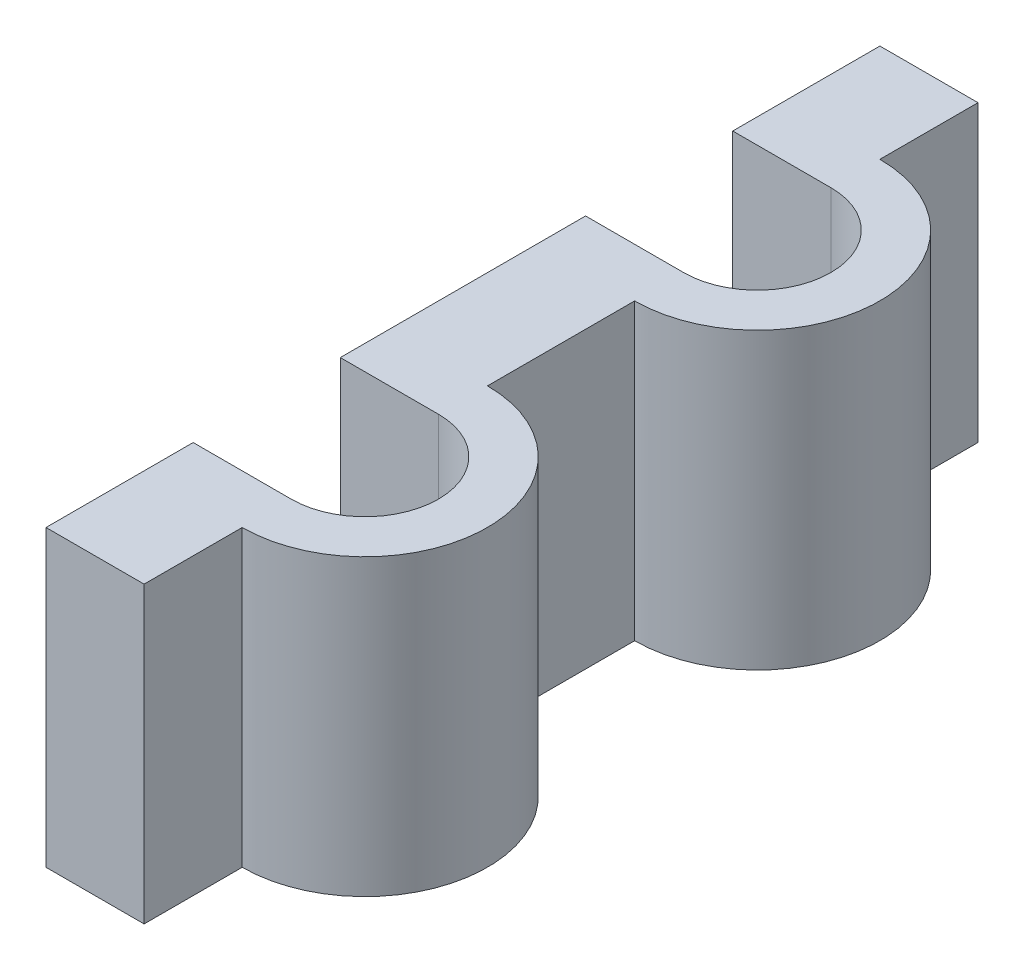
ISO-10303-21;
HEADER;
FILE_DESCRIPTION(('STEP AP214'),'2;1');
FILE_NAME('part.step','',(''),(''),'','','');
FILE_SCHEMA(('AUTOMOTIVE_DESIGN { 1 0 10303 214 1 1 1 1 }'));
ENDSEC;
DATA;
#1=APPLICATION_CONTEXT('core data for automotive mechanical design processes');
#2=APPLICATION_PROTOCOL_DEFINITION('international standard','automotive_design',2000,#1);
#3=PRODUCT_CONTEXT('',#1,'mechanical');
#4=PRODUCT('Part','Part','',(#3));
#5=PRODUCT_RELATED_PRODUCT_CATEGORY('part','',(#4));
#6=PRODUCT_DEFINITION_FORMATION('','',#4);
#7=PRODUCT_DEFINITION_CONTEXT('part definition',#1,'design');
#8=PRODUCT_DEFINITION('design','',#6,#7);
#9=PRODUCT_DEFINITION_SHAPE('','',#8);
#10=(LENGTH_UNIT() NAMED_UNIT(*) SI_UNIT(.MILLI.,.METRE.));
#11=(NAMED_UNIT(*) PLANE_ANGLE_UNIT() SI_UNIT($,.RADIAN.));
#12=(NAMED_UNIT(*) SI_UNIT($,.STERADIAN.) SOLID_ANGLE_UNIT());
#13=UNCERTAINTY_MEASURE_WITH_UNIT(LENGTH_MEASURE(1.E-05),#10,'distance_accuracy_value','');
#14=(GEOMETRIC_REPRESENTATION_CONTEXT(3) GLOBAL_UNCERTAINTY_ASSIGNED_CONTEXT((#13)) GLOBAL_UNIT_ASSIGNED_CONTEXT((#10,
#11,#12)) REPRESENTATION_CONTEXT('',''));
#15=CARTESIAN_POINT('',(0.,0.,0.));
#16=DIRECTION('',(0.,0.,1.));
#17=DIRECTION('',(1.,0.,0.));
#18=AXIS2_PLACEMENT_3D('',#15,#16,#17);
#19=CARTESIAN_POINT('',(0.,30.,0.));
#20=DIRECTION('',(0.,0.,-1.));
#21=DIRECTION('',(-1.,0.,0.));
#22=AXIS2_PLACEMENT_3D('',#19,#20,#21);
#23=PLANE('',#22);
#24=DIRECTION('',(1.,0.,0.));
#25=VECTOR('',#24,1.);
#26=CARTESIAN_POINT('',(0.,0.,0.));
#27=LINE('',#26,#25);
#28=CARTESIAN_POINT('',(0.,0.,0.));
#29=VERTEX_POINT('',#28);
#30=CARTESIAN_POINT('',(10.,0.,0.));
#31=VERTEX_POINT('',#30);
#32=EDGE_CURVE('E179',#29,#31,#27,.T.);
#33=ORIENTED_EDGE('',*,*,#32,.T.);
#34=DIRECTION('',(0.,-1.,0.));
#35=VECTOR('',#34,1.);
#36=CARTESIAN_POINT('',(10.,30.,0.));
#37=LINE('',#36,#35);
#38=CARTESIAN_POINT('',(10.,30.,0.));
#39=VERTEX_POINT('',#38);
#40=EDGE_CURVE('E11',#39,#31,#37,.T.);
#41=ORIENTED_EDGE('',*,*,#40,.F.);
#42=DIRECTION('',(1.,0.,0.));
#43=VECTOR('',#42,1.);
#44=CARTESIAN_POINT('',(0.,30.,0.));
#45=LINE('',#44,#43);
#46=CARTESIAN_POINT('',(0.,30.,0.));
#47=VERTEX_POINT('',#46);
#48=EDGE_CURVE('E209',#47,#39,#45,.T.);
#49=ORIENTED_EDGE('',*,*,#48,.F.);
#50=DIRECTION('',(0.,-1.,0.));
#51=VECTOR('',#50,1.);
#52=CARTESIAN_POINT('',(0.,30.,0.));
#53=LINE('',#52,#51);
#54=EDGE_CURVE('E175',#47,#29,#53,.T.);
#55=ORIENTED_EDGE('',*,*,#54,.T.);
#56=EDGE_LOOP('',(#33,#41,#49,#55));
#57=FACE_BOUND('',#56,.T.);
#58=ADVANCED_FACE('F35',(#57),#23,.F.);
#59=CARTESIAN_POINT('',(10.,30.,0.));
#60=DIRECTION('',(-1.,0.,0.));
#61=DIRECTION('',(0.,0.,1.));
#62=AXIS2_PLACEMENT_3D('',#59,#60,#61);
#63=PLANE('',#62);
#64=DIRECTION('',(0.,0.,-1.));
#65=VECTOR('',#64,1.);
#66=CARTESIAN_POINT('',(10.,0.,0.));
#67=LINE('',#66,#65);
#68=CARTESIAN_POINT('',(10.,0.,-10.));
#69=VERTEX_POINT('',#68);
#70=EDGE_CURVE('E182',#31,#69,#67,.T.);
#71=ORIENTED_EDGE('',*,*,#70,.T.);
#72=DIRECTION('',(0.,-1.,0.));
#73=VECTOR('',#72,1.);
#74=CARTESIAN_POINT('',(10.,30.,-10.));
#75=LINE('',#74,#73);
#76=CARTESIAN_POINT('',(10.,30.,-10.));
#77=VERTEX_POINT('',#76);
#78=EDGE_CURVE('E43',#77,#69,#75,.T.);
#79=ORIENTED_EDGE('',*,*,#78,.F.);
#80=DIRECTION('',(0.,0.,-1.));
#81=VECTOR('',#80,1.);
#82=CARTESIAN_POINT('',(10.,30.,0.));
#83=LINE('',#82,#81);
#84=EDGE_CURVE('E118',#39,#77,#83,.T.);
#85=ORIENTED_EDGE('',*,*,#84,.F.);
#86=ORIENTED_EDGE('',*,*,#40,.T.);
#87=EDGE_LOOP('',(#71,#79,#85,#86));
#88=FACE_BOUND('',#87,.T.);
#89=ADVANCED_FACE('F307',(#88),#63,.F.);
#90=CARTESIAN_POINT('',(10.,30.,-22.5));
#91=DIRECTION('',(0.,-1.,0.));
#92=DIRECTION('',(0.,0.,-1.));
#93=AXIS2_PLACEMENT_3D('',#90,#91,#92);
#94=CYLINDRICAL_SURFACE('',#93,12.5);
#95=CARTESIAN_POINT('',(10.,0.,-22.5));
#96=DIRECTION('',(0.,1.,0.));
#97=DIRECTION('',(0.,0.,1.));
#98=AXIS2_PLACEMENT_3D('',#95,#96,#97);
#99=CIRCLE('',#98,12.5);
#100=CARTESIAN_POINT('',(10.,0.,-34.9999999999999));
#101=VERTEX_POINT('',#100);
#102=EDGE_CURVE('E184',#69,#101,#99,.T.);
#103=ORIENTED_EDGE('',*,*,#102,.T.);
#104=DIRECTION('',(0.,-1.,0.));
#105=VECTOR('',#104,1.);
#106=CARTESIAN_POINT('',(10.,30.,-34.9999999999999));
#107=LINE('',#106,#105);
#108=CARTESIAN_POINT('',(10.,30.,-34.9999999999999));
#109=VERTEX_POINT('',#108);
#110=EDGE_CURVE('E240',#109,#101,#107,.T.);
#111=ORIENTED_EDGE('',*,*,#110,.F.);
#112=CARTESIAN_POINT('',(10.,30.,-22.5));
#113=DIRECTION('',(0.,1.,0.));
#114=DIRECTION('',(0.,0.,1.));
#115=AXIS2_PLACEMENT_3D('',#112,#113,#114);
#116=CIRCLE('',#115,12.5);
#117=EDGE_CURVE('E248',#77,#109,#116,.T.);
#118=ORIENTED_EDGE('',*,*,#117,.F.);
#119=ORIENTED_EDGE('',*,*,#78,.T.);
#120=EDGE_LOOP('',(#103,#111,#118,#119));
#121=FACE_BOUND('',#120,.T.);
#122=ADVANCED_FACE('F246',(#121),#94,.T.);
#123=CARTESIAN_POINT('',(10.,30.,-34.9999999999999));
#124=DIRECTION('',(-1.,0.,0.));
#125=DIRECTION('',(0.,0.,1.));
#126=AXIS2_PLACEMENT_3D('',#123,#124,#125);
#127=PLANE('',#126);
#128=DIRECTION('',(0.,0.,-1.));
#129=VECTOR('',#128,1.);
#130=CARTESIAN_POINT('',(10.,0.,-34.9999999999999));
#131=LINE('',#130,#129);
#132=CARTESIAN_POINT('',(9.99999999999999,0.,-50.));
#133=VERTEX_POINT('',#132);
#134=EDGE_CURVE('E186',#101,#133,#131,.T.);
#135=ORIENTED_EDGE('',*,*,#134,.T.);
#136=DIRECTION('',(0.,-1.,0.));
#137=VECTOR('',#136,1.);
#138=CARTESIAN_POINT('',(9.99999999999999,30.,-50.));
#139=LINE('',#138,#137);
#140=CARTESIAN_POINT('',(9.99999999999999,30.,-50.));
#141=VERTEX_POINT('',#140);
#142=EDGE_CURVE('E237',#141,#133,#139,.T.);
#143=ORIENTED_EDGE('',*,*,#142,.F.);
#144=DIRECTION('',(0.,0.,-1.));
#145=VECTOR('',#144,1.);
#146=CARTESIAN_POINT('',(10.,30.,-34.9999999999999));
#147=LINE('',#146,#145);
#148=EDGE_CURVE('E266',#109,#141,#147,.T.);
#149=ORIENTED_EDGE('',*,*,#148,.F.);
#150=ORIENTED_EDGE('',*,*,#110,.T.);
#151=EDGE_LOOP('',(#135,#143,#149,#150));
#152=FACE_BOUND('',#151,.T.);
#153=ADVANCED_FACE('F257',(#152),#127,.F.);
#154=CARTESIAN_POINT('',(10.,30.,-62.5));
#155=DIRECTION('',(0.,-1.,0.));
#156=DIRECTION('',(0.,0.,-1.));
#157=AXIS2_PLACEMENT_3D('',#154,#155,#156);
#158=CYLINDRICAL_SURFACE('',#157,12.5);
#159=CARTESIAN_POINT('',(10.,0.,-62.5));
#160=DIRECTION('',(0.,1.,0.));
#161=DIRECTION('',(0.,0.,-1.));
#162=AXIS2_PLACEMENT_3D('',#159,#160,#161);
#163=CIRCLE('',#162,12.5);
#164=CARTESIAN_POINT('',(10.,0.,-74.9999999999999));
#165=VERTEX_POINT('',#164);
#166=EDGE_CURVE('E188',#133,#165,#163,.T.);
#167=ORIENTED_EDGE('',*,*,#166,.T.);
#168=DIRECTION('',(0.,-1.,0.));
#169=VECTOR('',#168,1.);
#170=CARTESIAN_POINT('',(10.,30.,-74.9999999999999));
#171=LINE('',#170,#169);
#172=CARTESIAN_POINT('',(10.,30.,-74.9999999999999));
#173=VERTEX_POINT('',#172);
#174=EDGE_CURVE('E234',#173,#165,#171,.T.);
#175=ORIENTED_EDGE('',*,*,#174,.F.);
#176=CARTESIAN_POINT('',(10.,30.,-62.5));
#177=DIRECTION('',(0.,1.,0.));
#178=DIRECTION('',(0.,0.,-1.));
#179=AXIS2_PLACEMENT_3D('',#176,#177,#178);
#180=CIRCLE('',#179,12.5);
#181=EDGE_CURVE('E263',#141,#173,#180,.T.);
#182=ORIENTED_EDGE('',*,*,#181,.F.);
#183=ORIENTED_EDGE('',*,*,#142,.T.);
#184=EDGE_LOOP('',(#167,#175,#182,#183));
#185=FACE_BOUND('',#184,.T.);
#186=ADVANCED_FACE('F261',(#185),#158,.T.);
#187=CARTESIAN_POINT('',(10.,30.,-84.9999999999999));
#188=DIRECTION('',(-1.,0.,0.));
#189=DIRECTION('',(0.,0.,1.));
#190=AXIS2_PLACEMENT_3D('',#187,#188,#189);
#191=PLANE('',#190);
#192=DIRECTION('',(0.,0.,-1.));
#193=VECTOR('',#192,1.);
#194=CARTESIAN_POINT('',(10.,0.,-84.9999999999999));
#195=LINE('',#194,#193);
#196=CARTESIAN_POINT('',(10.,0.,-84.9999999999999));
#197=VERTEX_POINT('',#196);
#198=EDGE_CURVE('E190',#165,#197,#195,.T.);
#199=ORIENTED_EDGE('',*,*,#198,.T.);
#200=DIRECTION('',(0.,-1.,0.));
#201=VECTOR('',#200,1.);
#202=CARTESIAN_POINT('',(10.,30.,-84.9999999999999));
#203=LINE('',#202,#201);
#204=CARTESIAN_POINT('',(10.,30.,-84.9999999999999));
#205=VERTEX_POINT('',#204);
#206=EDGE_CURVE('E231',#205,#197,#203,.T.);
#207=ORIENTED_EDGE('',*,*,#206,.F.);
#208=DIRECTION('',(0.,0.,-1.));
#209=VECTOR('',#208,1.);
#210=CARTESIAN_POINT('',(10.,30.,-84.9999999999999));
#211=LINE('',#210,#209);
#212=EDGE_CURVE('E265',#173,#205,#211,.T.);
#213=ORIENTED_EDGE('',*,*,#212,.F.);
#214=ORIENTED_EDGE('',*,*,#174,.T.);
#215=EDGE_LOOP('',(#199,#207,#213,#214));
#216=FACE_BOUND('',#215,.T.);
#217=ADVANCED_FACE('F320',(#216),#191,.F.);
#218=CARTESIAN_POINT('',(0.,30.,-84.9999999999999));
#219=DIRECTION('',(0.,0.,1.));
#220=DIRECTION('',(1.,0.,0.));
#221=AXIS2_PLACEMENT_3D('',#218,#219,#220);
#222=PLANE('',#221);
#223=DIRECTION('',(-1.,0.,0.));
#224=VECTOR('',#223,1.);
#225=CARTESIAN_POINT('',(0.,0.,-84.9999999999999));
#226=LINE('',#225,#224);
#227=CARTESIAN_POINT('',(0.,0.,-84.9999999999999));
#228=VERTEX_POINT('',#227);
#229=EDGE_CURVE('E192',#197,#228,#226,.T.);
#230=ORIENTED_EDGE('',*,*,#229,.T.);
#231=DIRECTION('',(0.,-1.,0.));
#232=VECTOR('',#231,1.);
#233=CARTESIAN_POINT('',(0.,30.,-84.9999999999999));
#234=LINE('',#233,#232);
#235=CARTESIAN_POINT('',(0.,30.,-84.9999999999999));
#236=VERTEX_POINT('',#235);
#237=EDGE_CURVE('E228',#236,#228,#234,.T.);
#238=ORIENTED_EDGE('',*,*,#237,.F.);
#239=DIRECTION('',(-1.,0.,0.));
#240=VECTOR('',#239,1.);
#241=CARTESIAN_POINT('',(0.,30.,-84.9999999999999));
#242=LINE('',#241,#240);
#243=EDGE_CURVE('E268',#205,#236,#242,.T.);
#244=ORIENTED_EDGE('',*,*,#243,.F.);
#245=ORIENTED_EDGE('',*,*,#206,.T.);
#246=EDGE_LOOP('',(#230,#238,#244,#245));
#247=FACE_BOUND('',#246,.T.);
#248=ADVANCED_FACE('F323',(#247),#222,.F.);
#249=CARTESIAN_POINT('',(0.,30.,-84.9999999999999));
#250=DIRECTION('',(1.,0.,0.));
#251=DIRECTION('',(0.,0.,-1.));
#252=AXIS2_PLACEMENT_3D('',#249,#250,#251);
#253=PLANE('',#252);
#254=DIRECTION('',(0.,0.,1.));
#255=VECTOR('',#254,1.);
#256=CARTESIAN_POINT('',(0.,0.,-84.9999999999999));
#257=LINE('',#256,#255);
#258=CARTESIAN_POINT('',(0.,0.,-70.));
#259=VERTEX_POINT('',#258);
#260=EDGE_CURVE('E194',#228,#259,#257,.T.);
#261=ORIENTED_EDGE('',*,*,#260,.T.);
#262=DIRECTION('',(0.,-1.,0.));
#263=VECTOR('',#262,1.);
#264=CARTESIAN_POINT('',(0.,30.,-70.));
#265=LINE('',#264,#263);
#266=CARTESIAN_POINT('',(0.,30.,-70.));
#267=VERTEX_POINT('',#266);
#268=EDGE_CURVE('E225',#267,#259,#265,.T.);
#269=ORIENTED_EDGE('',*,*,#268,.F.);
#270=DIRECTION('',(0.,0.,1.));
#271=VECTOR('',#270,1.);
#272=CARTESIAN_POINT('',(0.,30.,-84.9999999999999));
#273=LINE('',#272,#271);
#274=EDGE_CURVE('E274',#236,#267,#273,.T.);
#275=ORIENTED_EDGE('',*,*,#274,.F.);
#276=ORIENTED_EDGE('',*,*,#237,.T.);
#277=EDGE_LOOP('',(#261,#269,#275,#276));
#278=FACE_BOUND('',#277,.T.);
#279=ADVANCED_FACE('F327',(#278),#253,.F.);
#280=CARTESIAN_POINT('',(0.,30.,-70.));
#281=DIRECTION('',(0.,0.,-1.));
#282=DIRECTION('',(-1.,0.,0.));
#283=AXIS2_PLACEMENT_3D('',#280,#281,#282);
#284=PLANE('',#283);
#285=DIRECTION('',(1.,0.,0.));
#286=VECTOR('',#285,1.);
#287=CARTESIAN_POINT('',(0.,0.,-70.));
#288=LINE('',#287,#286);
#289=CARTESIAN_POINT('',(9.99999910142864,0.,-70.));
#290=VERTEX_POINT('',#289);
#291=EDGE_CURVE('E196',#259,#290,#288,.T.);
#292=ORIENTED_EDGE('',*,*,#291,.T.);
#293=DIRECTION('',(0.,-1.,0.));
#294=VECTOR('',#293,1.);
#295=CARTESIAN_POINT('',(9.99999910142864,30.,-70.));
#296=LINE('',#295,#294);
#297=CARTESIAN_POINT('',(9.99999910142864,30.,-70.));
#298=VERTEX_POINT('',#297);
#299=EDGE_CURVE('E222',#298,#290,#296,.T.);
#300=ORIENTED_EDGE('',*,*,#299,.F.);
#301=DIRECTION('',(1.,0.,0.));
#302=VECTOR('',#301,1.);
#303=CARTESIAN_POINT('',(0.,30.,-70.));
#304=LINE('',#303,#302);
#305=EDGE_CURVE('E276',#267,#298,#304,.T.);
#306=ORIENTED_EDGE('',*,*,#305,.F.);
#307=ORIENTED_EDGE('',*,*,#268,.T.);
#308=EDGE_LOOP('',(#292,#300,#306,#307));
#309=FACE_BOUND('',#308,.T.);
#310=ADVANCED_FACE('F331',(#309),#284,.F.);
#311=CARTESIAN_POINT('',(10.,30.,-62.5));
#312=DIRECTION('',(0.,-1.,0.));
#313=DIRECTION('',(0.,0.,-1.));
#314=AXIS2_PLACEMENT_3D('',#311,#312,#313);
#315=CYLINDRICAL_SURFACE('',#314,7.50000000000005);
#316=CARTESIAN_POINT('',(10.,0.,-62.5));
#317=DIRECTION('',(0.,-1.,0.));
#318=DIRECTION('',(0.,0.,1.));
#319=AXIS2_PLACEMENT_3D('',#316,#317,#318);
#320=CIRCLE('',#319,7.50000000000005);
#321=CARTESIAN_POINT('',(9.99999910142863,0.,-55.));
#322=VERTEX_POINT('',#321);
#323=EDGE_CURVE('E198',#290,#322,#320,.T.);
#324=ORIENTED_EDGE('',*,*,#323,.T.);
#325=DIRECTION('',(0.,-1.,0.));
#326=VECTOR('',#325,1.);
#327=CARTESIAN_POINT('',(9.99999910142863,30.,-55.));
#328=LINE('',#327,#326);
#329=CARTESIAN_POINT('',(9.99999910142863,30.,-55.));
#330=VERTEX_POINT('',#329);
#331=EDGE_CURVE('E219',#330,#322,#328,.T.);
#332=ORIENTED_EDGE('',*,*,#331,.F.);
#333=CARTESIAN_POINT('',(10.,30.,-62.5));
#334=DIRECTION('',(0.,-1.,0.));
#335=DIRECTION('',(0.,0.,1.));
#336=AXIS2_PLACEMENT_3D('',#333,#334,#335);
#337=CIRCLE('',#336,7.50000000000005);
#338=EDGE_CURVE('E278',#298,#330,#337,.T.);
#339=ORIENTED_EDGE('',*,*,#338,.F.);
#340=ORIENTED_EDGE('',*,*,#299,.T.);
#341=EDGE_LOOP('',(#324,#332,#339,#340));
#342=FACE_BOUND('',#341,.T.);
#343=ADVANCED_FACE('F335',(#342),#315,.F.);
#344=CARTESIAN_POINT('',(0.,30.,-55.));
#345=DIRECTION('',(0.,0.,1.));
#346=DIRECTION('',(1.,0.,0.));
#347=AXIS2_PLACEMENT_3D('',#344,#345,#346);
#348=PLANE('',#347);
#349=DIRECTION('',(-1.,0.,0.));
#350=VECTOR('',#349,1.);
#351=CARTESIAN_POINT('',(0.,0.,-55.));
#352=LINE('',#351,#350);
#353=CARTESIAN_POINT('',(0.,0.,-55.));
#354=VERTEX_POINT('',#353);
#355=EDGE_CURVE('E200',#322,#354,#352,.T.);
#356=ORIENTED_EDGE('',*,*,#355,.T.);
#357=DIRECTION('',(0.,-1.,0.));
#358=VECTOR('',#357,1.);
#359=CARTESIAN_POINT('',(0.,30.,-55.));
#360=LINE('',#359,#358);
#361=CARTESIAN_POINT('',(0.,30.,-55.));
#362=VERTEX_POINT('',#361);
#363=EDGE_CURVE('E216',#362,#354,#360,.T.);
#364=ORIENTED_EDGE('',*,*,#363,.F.);
#365=DIRECTION('',(-1.,0.,0.));
#366=VECTOR('',#365,1.);
#367=CARTESIAN_POINT('',(0.,30.,-55.));
#368=LINE('',#367,#366);
#369=EDGE_CURVE('E280',#330,#362,#368,.T.);
#370=ORIENTED_EDGE('',*,*,#369,.F.);
#371=ORIENTED_EDGE('',*,*,#331,.T.);
#372=EDGE_LOOP('',(#356,#364,#370,#371));
#373=FACE_BOUND('',#372,.T.);
#374=ADVANCED_FACE('F339',(#373),#348,.F.);
#375=CARTESIAN_POINT('',(0.,30.,-30.));
#376=DIRECTION('',(1.,0.,0.));
#377=DIRECTION('',(0.,0.,-1.));
#378=AXIS2_PLACEMENT_3D('',#375,#376,#377);
#379=PLANE('',#378);
#380=DIRECTION('',(0.,0.,1.));
#381=VECTOR('',#380,1.);
#382=CARTESIAN_POINT('',(0.,0.,-30.));
#383=LINE('',#382,#381);
#384=CARTESIAN_POINT('',(0.,0.,-30.));
#385=VERTEX_POINT('',#384);
#386=EDGE_CURVE('E202',#354,#385,#383,.T.);
#387=ORIENTED_EDGE('',*,*,#386,.T.);
#388=DIRECTION('',(0.,-1.,0.));
#389=VECTOR('',#388,1.);
#390=CARTESIAN_POINT('',(0.,30.,-30.));
#391=LINE('',#390,#389);
#392=CARTESIAN_POINT('',(0.,30.,-30.));
#393=VERTEX_POINT('',#392);
#394=EDGE_CURVE('E213',#393,#385,#391,.T.);
#395=ORIENTED_EDGE('',*,*,#394,.F.);
#396=DIRECTION('',(0.,0.,1.));
#397=VECTOR('',#396,1.);
#398=CARTESIAN_POINT('',(0.,30.,-30.));
#399=LINE('',#398,#397);
#400=EDGE_CURVE('E282',#362,#393,#399,.T.);
#401=ORIENTED_EDGE('',*,*,#400,.F.);
#402=ORIENTED_EDGE('',*,*,#363,.T.);
#403=EDGE_LOOP('',(#387,#395,#401,#402));
#404=FACE_BOUND('',#403,.T.);
#405=ADVANCED_FACE('F288',(#404),#379,.F.);
#406=CARTESIAN_POINT('',(0.,30.,-30.));
#407=DIRECTION('',(0.,0.,-1.));
#408=DIRECTION('',(-1.,0.,0.));
#409=AXIS2_PLACEMENT_3D('',#406,#407,#408);
#410=PLANE('',#409);
#411=DIRECTION('',(1.,0.,0.));
#412=VECTOR('',#411,1.);
#413=CARTESIAN_POINT('',(0.,0.,-30.));
#414=LINE('',#413,#412);
#415=CARTESIAN_POINT('',(9.99999910142863,0.,-30.));
#416=VERTEX_POINT('',#415);
#417=EDGE_CURVE('E204',#385,#416,#414,.T.);
#418=ORIENTED_EDGE('',*,*,#417,.T.);
#419=DIRECTION('',(0.,-1.,0.));
#420=VECTOR('',#419,1.);
#421=CARTESIAN_POINT('',(9.99999910142863,30.,-30.));
#422=LINE('',#421,#420);
#423=CARTESIAN_POINT('',(9.99999910142863,30.,-30.));
#424=VERTEX_POINT('',#423);
#425=EDGE_CURVE('E170',#424,#416,#422,.T.);
#426=ORIENTED_EDGE('',*,*,#425,.F.);
#427=DIRECTION('',(1.,0.,0.));
#428=VECTOR('',#427,1.);
#429=CARTESIAN_POINT('',(0.,30.,-30.));
#430=LINE('',#429,#428);
#431=EDGE_CURVE('E161',#393,#424,#430,.T.);
#432=ORIENTED_EDGE('',*,*,#431,.F.);
#433=ORIENTED_EDGE('',*,*,#394,.T.);
#434=EDGE_LOOP('',(#418,#426,#432,#433));
#435=FACE_BOUND('',#434,.T.);
#436=ADVANCED_FACE('F292',(#435),#410,.F.);
#437=CARTESIAN_POINT('',(10.,30.,-22.5));
#438=DIRECTION('',(0.,-1.,0.));
#439=DIRECTION('',(0.,0.,-1.));
#440=AXIS2_PLACEMENT_3D('',#437,#438,#439);
#441=CYLINDRICAL_SURFACE('',#440,7.50000000000005);
#442=CARTESIAN_POINT('',(10.,0.,-22.5));
#443=DIRECTION('',(0.,-1.,0.));
#444=DIRECTION('',(0.,0.,-1.));
#445=AXIS2_PLACEMENT_3D('',#442,#443,#444);
#446=CIRCLE('',#445,7.50000000000005);
#447=CARTESIAN_POINT('',(9.99999910142863,0.,-15.));
#448=VERTEX_POINT('',#447);
#449=EDGE_CURVE('E169',#416,#448,#446,.T.);
#450=ORIENTED_EDGE('',*,*,#449,.T.);
#451=DIRECTION('',(0.,-1.,0.));
#452=VECTOR('',#451,1.);
#453=CARTESIAN_POINT('',(9.99999910142863,30.,-15.));
#454=LINE('',#453,#452);
#455=CARTESIAN_POINT('',(9.99999910142863,30.,-15.));
#456=VERTEX_POINT('',#455);
#457=EDGE_CURVE('E166',#456,#448,#454,.T.);
#458=ORIENTED_EDGE('',*,*,#457,.F.);
#459=CARTESIAN_POINT('',(10.,30.,-22.5));
#460=DIRECTION('',(0.,-1.,0.));
#461=DIRECTION('',(0.,0.,-1.));
#462=AXIS2_PLACEMENT_3D('',#459,#460,#461);
#463=CIRCLE('',#462,7.50000000000005);
#464=EDGE_CURVE('E155',#424,#456,#463,.T.);
#465=ORIENTED_EDGE('',*,*,#464,.F.);
#466=ORIENTED_EDGE('',*,*,#425,.T.);
#467=EDGE_LOOP('',(#450,#458,#465,#466));
#468=FACE_BOUND('',#467,.T.);
#469=ADVANCED_FACE('F167',(#468),#441,.F.);
#470=CARTESIAN_POINT('',(0.,30.,-15.));
#471=DIRECTION('',(0.,0.,1.));
#472=DIRECTION('',(1.,0.,0.));
#473=AXIS2_PLACEMENT_3D('',#470,#471,#472);
#474=PLANE('',#473);
#475=DIRECTION('',(-1.,0.,0.));
#476=VECTOR('',#475,1.);
#477=CARTESIAN_POINT('',(0.,0.,-15.));
#478=LINE('',#477,#476);
#479=CARTESIAN_POINT('',(0.,0.,-15.));
#480=VERTEX_POINT('',#479);
#481=EDGE_CURVE('E104',#448,#480,#478,.T.);
#482=ORIENTED_EDGE('',*,*,#481,.T.);
#483=DIRECTION('',(0.,-1.,0.));
#484=VECTOR('',#483,1.);
#485=CARTESIAN_POINT('',(0.,30.,-15.));
#486=LINE('',#485,#484);
#487=CARTESIAN_POINT('',(0.,30.,-15.));
#488=VERTEX_POINT('',#487);
#489=EDGE_CURVE('E171',#488,#480,#486,.T.);
#490=ORIENTED_EDGE('',*,*,#489,.F.);
#491=DIRECTION('',(-1.,0.,0.));
#492=VECTOR('',#491,1.);
#493=CARTESIAN_POINT('',(0.,30.,-15.));
#494=LINE('',#493,#492);
#495=EDGE_CURVE('E159',#456,#488,#494,.T.);
#496=ORIENTED_EDGE('',*,*,#495,.F.);
#497=ORIENTED_EDGE('',*,*,#457,.T.);
#498=EDGE_LOOP('',(#482,#490,#496,#497));
#499=FACE_BOUND('',#498,.T.);
#500=ADVANCED_FACE('F173',(#499),#474,.F.);
#501=CARTESIAN_POINT('',(0.,30.,0.));
#502=DIRECTION('',(1.,0.,0.));
#503=DIRECTION('',(0.,0.,-1.));
#504=AXIS2_PLACEMENT_3D('',#501,#502,#503);
#505=PLANE('',#504);
#506=DIRECTION('',(0.,0.,1.));
#507=VECTOR('',#506,1.);
#508=CARTESIAN_POINT('',(0.,0.,0.));
#509=LINE('',#508,#507);
#510=EDGE_CURVE('E110',#480,#29,#509,.T.);
#511=ORIENTED_EDGE('',*,*,#510,.T.);
#512=ORIENTED_EDGE('',*,*,#54,.F.);
#513=DIRECTION('',(0.,0.,1.));
#514=VECTOR('',#513,1.);
#515=CARTESIAN_POINT('',(0.,30.,0.));
#516=LINE('',#515,#514);
#517=EDGE_CURVE('E51',#488,#47,#516,.T.);
#518=ORIENTED_EDGE('',*,*,#517,.F.);
#519=ORIENTED_EDGE('',*,*,#489,.T.);
#520=EDGE_LOOP('',(#511,#512,#518,#519));
#521=FACE_BOUND('',#520,.T.);
#522=ADVANCED_FACE('F296',(#521),#505,.F.);
#523=CARTESIAN_POINT('',(10.,30.,-22.5));
#524=DIRECTION('',(0.,1.,0.));
#525=DIRECTION('',(0.,0.,1.));
#526=AXIS2_PLACEMENT_3D('',#523,#524,#525);
#527=PLANE('',#526);
#528=ORIENTED_EDGE('',*,*,#48,.T.);
#529=ORIENTED_EDGE('',*,*,#84,.T.);
#530=ORIENTED_EDGE('',*,*,#117,.T.);
#531=ORIENTED_EDGE('',*,*,#148,.T.);
#532=ORIENTED_EDGE('',*,*,#181,.T.);
#533=ORIENTED_EDGE('',*,*,#212,.T.);
#534=ORIENTED_EDGE('',*,*,#243,.T.);
#535=ORIENTED_EDGE('',*,*,#274,.T.);
#536=ORIENTED_EDGE('',*,*,#305,.T.);
#537=ORIENTED_EDGE('',*,*,#338,.T.);
#538=ORIENTED_EDGE('',*,*,#369,.T.);
#539=ORIENTED_EDGE('',*,*,#400,.T.);
#540=ORIENTED_EDGE('',*,*,#431,.T.);
#541=ORIENTED_EDGE('',*,*,#464,.T.);
#542=ORIENTED_EDGE('',*,*,#495,.T.);
#543=ORIENTED_EDGE('',*,*,#517,.T.);
#544=EDGE_LOOP('',(#528,#529,#530,#531,#532,#533,#534,#535,#536,#537,#538,#539,#540,#541,#542,#543));
#545=FACE_BOUND('',#544,.T.);
#546=ADVANCED_FACE('F157',(#545),#527,.T.);
#547=CARTESIAN_POINT('',(10.,0.,-22.5));
#548=DIRECTION('',(0.,1.,0.));
#549=DIRECTION('',(0.,0.,1.));
#550=AXIS2_PLACEMENT_3D('',#547,#548,#549);
#551=PLANE('',#550);
#552=ORIENTED_EDGE('',*,*,#32,.F.);
#553=ORIENTED_EDGE('',*,*,#510,.F.);
#554=ORIENTED_EDGE('',*,*,#481,.F.);
#555=ORIENTED_EDGE('',*,*,#449,.F.);
#556=ORIENTED_EDGE('',*,*,#417,.F.);
#557=ORIENTED_EDGE('',*,*,#386,.F.);
#558=ORIENTED_EDGE('',*,*,#355,.F.);
#559=ORIENTED_EDGE('',*,*,#323,.F.);
#560=ORIENTED_EDGE('',*,*,#291,.F.);
#561=ORIENTED_EDGE('',*,*,#260,.F.);
#562=ORIENTED_EDGE('',*,*,#229,.F.);
#563=ORIENTED_EDGE('',*,*,#198,.F.);
#564=ORIENTED_EDGE('',*,*,#166,.F.);
#565=ORIENTED_EDGE('',*,*,#134,.F.);
#566=ORIENTED_EDGE('',*,*,#102,.F.);
#567=ORIENTED_EDGE('',*,*,#70,.F.);
#568=EDGE_LOOP('',(#552,#553,#554,#555,#556,#557,#558,#559,#560,#561,#562,#563,#564,#565,#566,#567));
#569=FACE_BOUND('',#568,.T.);
#570=ADVANCED_FACE('F252',(#569),#551,.F.);
#571=CLOSED_SHELL('',(#58,#89,#122,#153,#186,#217,#248,#279,#310,#343,#374,#405,#436,#469,#500,
#522,#546,#570));
#572=MANIFOLD_SOLID_BREP('B2',#571);
#573=ADVANCED_BREP_SHAPE_REPRESENTATION('',(#18,#572),#14);
#574=SHAPE_DEFINITION_REPRESENTATION(#9,#573);
ENDSEC;
END-ISO-10303-21;
